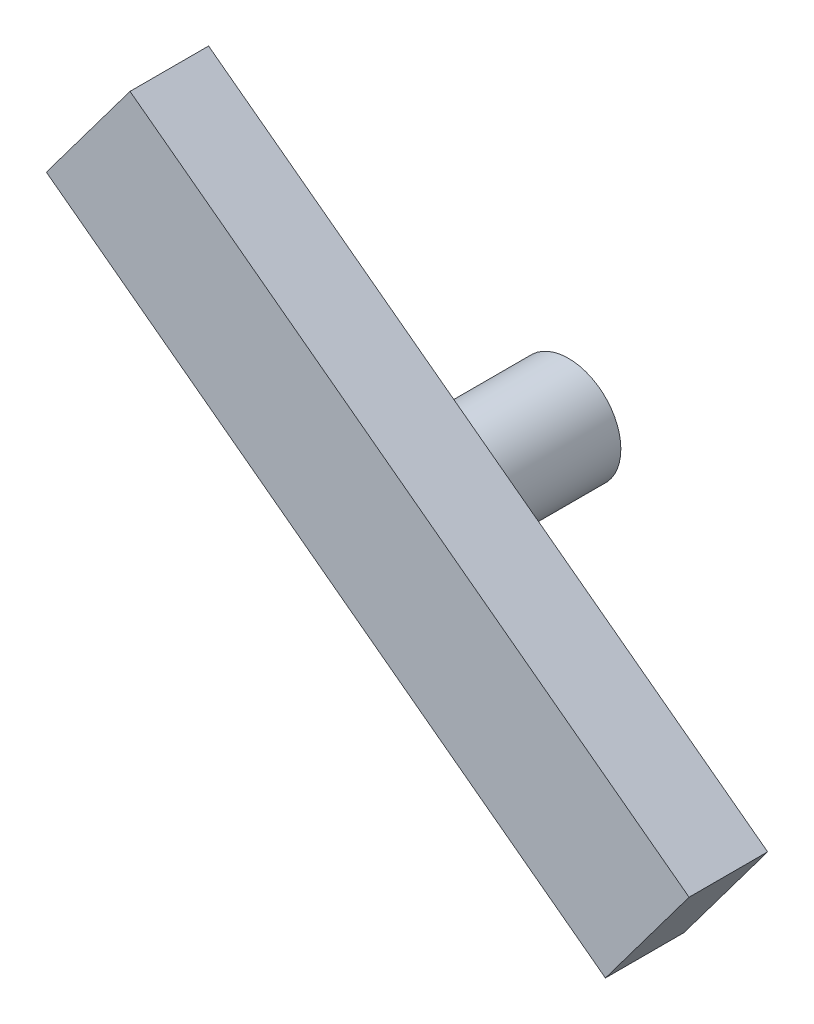
ISO-10303-21;
HEADER;
FILE_DESCRIPTION(('STEP AP214'),'2;1');
FILE_NAME('part.step','',(''),(''),'','','');
FILE_SCHEMA(('AUTOMOTIVE_DESIGN { 1 0 10303 214 1 1 1 1 }'));
ENDSEC;
DATA;
#1=APPLICATION_CONTEXT('core data for automotive mechanical design processes');
#2=APPLICATION_PROTOCOL_DEFINITION('international standard','automotive_design',2000,#1);
#3=PRODUCT_CONTEXT('',#1,'mechanical');
#4=PRODUCT('Part','Part','',(#3));
#5=PRODUCT_RELATED_PRODUCT_CATEGORY('part','',(#4));
#6=PRODUCT_DEFINITION_FORMATION('','',#4);
#7=PRODUCT_DEFINITION_CONTEXT('part definition',#1,'design');
#8=PRODUCT_DEFINITION('design','',#6,#7);
#9=PRODUCT_DEFINITION_SHAPE('','',#8);
#10=(LENGTH_UNIT() NAMED_UNIT(*) SI_UNIT(.MILLI.,.METRE.));
#11=(NAMED_UNIT(*) PLANE_ANGLE_UNIT() SI_UNIT($,.RADIAN.));
#12=(NAMED_UNIT(*) SI_UNIT($,.STERADIAN.) SOLID_ANGLE_UNIT());
#13=UNCERTAINTY_MEASURE_WITH_UNIT(LENGTH_MEASURE(1.E-05),#10,'distance_accuracy_value','');
#14=(GEOMETRIC_REPRESENTATION_CONTEXT(3) GLOBAL_UNCERTAINTY_ASSIGNED_CONTEXT((#13)) GLOBAL_UNIT_ASSIGNED_CONTEXT((#10,
#11,#12)) REPRESENTATION_CONTEXT('',''));
#15=CARTESIAN_POINT('',(0.,0.,0.));
#16=DIRECTION('',(0.,0.,1.));
#17=DIRECTION('',(1.,0.,0.));
#18=AXIS2_PLACEMENT_3D('',#15,#16,#17);
#19=CARTESIAN_POINT('',(-263.128358849387,316.504901667894,-22.));
#20=DIRECTION('',(0.,0.,1.));
#21=DIRECTION('',(1.,0.,0.));
#22=AXIS2_PLACEMENT_3D('',#19,#20,#21);
#23=PLANE('',#22);
#24=CARTESIAN_POINT('',(-263.128358849387,316.504901667894,-22.));
#25=DIRECTION('',(0.,0.,1.));
#26=DIRECTION('',(1.,0.,0.));
#27=AXIS2_PLACEMENT_3D('',#24,#25,#26);
#28=CIRCLE('',#27,3.);
#29=CARTESIAN_POINT('',(-260.128358849387,316.504901667894,-22.));
#30=VERTEX_POINT('',#29);
#31=EDGE_CURVE('E49',#30,#30,#28,.T.);
#32=ORIENTED_EDGE('',*,*,#31,.F.);
#33=EDGE_LOOP('',(#32));
#34=FACE_BOUND('',#33,.T.);
#35=ADVANCED_FACE('F41',(#34),#23,.F.);
#36=CARTESIAN_POINT('',(-263.128358849387,316.504901667894,-22.));
#37=DIRECTION('',(0.,0.,1.));
#38=DIRECTION('',(1.,0.,0.));
#39=AXIS2_PLACEMENT_3D('',#36,#37,#38);
#40=CYLINDRICAL_SURFACE('',#39,3.);
#41=CARTESIAN_POINT('',(-263.128358849387,316.504901667894,-15.));
#42=DIRECTION('',(0.,0.,1.));
#43=DIRECTION('',(1.,0.,0.));
#44=AXIS2_PLACEMENT_3D('',#41,#42,#43);
#45=CIRCLE('',#44,3.);
#46=CARTESIAN_POINT('',(-260.128358849387,316.504901667894,-15.));
#47=VERTEX_POINT('',#46);
#48=EDGE_CURVE('E12',#47,#47,#45,.T.);
#49=ORIENTED_EDGE('',*,*,#48,.F.);
#50=EDGE_LOOP('',(#49));
#51=FACE_BOUND('',#50,.T.);
#52=ORIENTED_EDGE('',*,*,#31,.T.);
#53=EDGE_LOOP('',(#52));
#54=FACE_BOUND('',#53,.T.);
#55=ADVANCED_FACE('F119',(#51,#54),#40,.T.);
#56=CARTESIAN_POINT('',(-281.537950913536,325.28481738683,-10.5));
#57=DIRECTION('',(0.599126640950297,0.800654275017385,0.));
#58=DIRECTION('',(-0.800654275017385,0.599126640950297,0.));
#59=AXIS2_PLACEMENT_3D('',#56,#57,#58);
#60=PLANE('',#59);
#61=DIRECTION('',(0.800654275017385,-0.599126640950297,0.));
#62=VECTOR('',#61,1.);
#63=CARTESIAN_POINT('',(-281.537950913536,325.28481738683,-15.));
#64=LINE('',#63,#62);
#65=CARTESIAN_POINT('',(-281.537950913536,325.28481738683,-15.));
#66=VERTEX_POINT('',#65);
#67=CARTESIAN_POINT('',(-249.51177991284,301.319751748818,-15.));
#68=VERTEX_POINT('',#67);
#69=EDGE_CURVE('E108',#66,#68,#64,.T.);
#70=ORIENTED_EDGE('',*,*,#69,.T.);
#71=DIRECTION('',(0.,0.,-1.));
#72=VECTOR('',#71,1.);
#73=CARTESIAN_POINT('',(-249.51177991284,301.319751748818,-10.5));
#74=LINE('',#73,#72);
#75=CARTESIAN_POINT('',(-249.51177991284,301.319751748818,-10.5));
#76=VERTEX_POINT('',#75);
#77=EDGE_CURVE('E99',#76,#68,#74,.T.);
#78=ORIENTED_EDGE('',*,*,#77,.F.);
#79=DIRECTION('',(0.800654275017385,-0.599126640950297,0.));
#80=VECTOR('',#79,1.);
#81=CARTESIAN_POINT('',(-281.537950913536,325.28481738683,-10.5));
#82=LINE('',#81,#80);
#83=CARTESIAN_POINT('',(-281.537950913536,325.28481738683,-10.5));
#84=VERTEX_POINT('',#83);
#85=EDGE_CURVE('E93',#84,#76,#82,.T.);
#86=ORIENTED_EDGE('',*,*,#85,.F.);
#87=DIRECTION('',(0.,0.,-1.));
#88=VECTOR('',#87,1.);
#89=CARTESIAN_POINT('',(-281.537950913536,325.28481738683,-10.5));
#90=LINE('',#89,#88);
#91=EDGE_CURVE('E104',#84,#66,#90,.T.);
#92=ORIENTED_EDGE('',*,*,#91,.T.);
#93=EDGE_LOOP('',(#70,#78,#86,#92));
#94=FACE_BOUND('',#93,.T.);
#95=ADVANCED_FACE('F122',(#94),#60,.F.);
#96=CARTESIAN_POINT('',(-249.51177991284,301.319751748818,-10.5));
#97=DIRECTION('',(-0.800654275017387,0.599126640950294,0.));
#98=DIRECTION('',(-0.599126640950294,-0.800654275017387,0.));
#99=AXIS2_PLACEMENT_3D('',#96,#97,#98);
#100=PLANE('',#99);
#101=DIRECTION('',(0.599126640950294,0.800654275017387,0.));
#102=VECTOR('',#101,1.);
#103=CARTESIAN_POINT('',(-249.51177991284,301.319751748818,-15.));
#104=LINE('',#103,#102);
#105=CARTESIAN_POINT('',(-244.718766785238,307.724985948958,-15.));
#106=VERTEX_POINT('',#105);
#107=EDGE_CURVE('E98',#68,#106,#104,.T.);
#108=ORIENTED_EDGE('',*,*,#107,.T.);
#109=DIRECTION('',(0.,0.,-1.));
#110=VECTOR('',#109,1.);
#111=CARTESIAN_POINT('',(-244.718766785238,307.724985948958,-10.5));
#112=LINE('',#111,#110);
#113=CARTESIAN_POINT('',(-244.718766785238,307.724985948958,-10.5));
#114=VERTEX_POINT('',#113);
#115=EDGE_CURVE('E96',#114,#106,#112,.T.);
#116=ORIENTED_EDGE('',*,*,#115,.F.);
#117=DIRECTION('',(0.599126640950294,0.800654275017387,0.));
#118=VECTOR('',#117,1.);
#119=CARTESIAN_POINT('',(-249.51177991284,301.319751748818,-10.5));
#120=LINE('',#119,#118);
#121=EDGE_CURVE('E88',#76,#114,#120,.T.);
#122=ORIENTED_EDGE('',*,*,#121,.F.);
#123=ORIENTED_EDGE('',*,*,#77,.T.);
#124=EDGE_LOOP('',(#108,#116,#122,#123));
#125=FACE_BOUND('',#124,.T.);
#126=ADVANCED_FACE('F97',(#125),#100,.F.);
#127=CARTESIAN_POINT('',(-244.718766785238,307.724985948958,-10.5));
#128=DIRECTION('',(-0.599126640950298,-0.800654275017384,0.));
#129=DIRECTION('',(0.800654275017384,-0.599126640950298,0.));
#130=AXIS2_PLACEMENT_3D('',#127,#128,#129);
#131=PLANE('',#130);
#132=DIRECTION('',(-0.800654275017384,0.599126640950298,0.));
#133=VECTOR('',#132,1.);
#134=CARTESIAN_POINT('',(-244.718766785238,307.724985948958,-15.));
#135=LINE('',#134,#133);
#136=CARTESIAN_POINT('',(-276.744937785933,331.690051586969,-15.));
#137=VERTEX_POINT('',#136);
#138=EDGE_CURVE('E74',#106,#137,#135,.T.);
#139=ORIENTED_EDGE('',*,*,#138,.T.);
#140=DIRECTION('',(0.,0.,-1.));
#141=VECTOR('',#140,1.);
#142=CARTESIAN_POINT('',(-276.744937785933,331.690051586969,-10.5));
#143=LINE('',#142,#141);
#144=CARTESIAN_POINT('',(-276.744937785933,331.690051586969,-10.5));
#145=VERTEX_POINT('',#144);
#146=EDGE_CURVE('E100',#145,#137,#143,.T.);
#147=ORIENTED_EDGE('',*,*,#146,.F.);
#148=DIRECTION('',(-0.800654275017384,0.599126640950298,0.));
#149=VECTOR('',#148,1.);
#150=CARTESIAN_POINT('',(-244.718766785238,307.724985948958,-10.5));
#151=LINE('',#150,#149);
#152=EDGE_CURVE('E91',#114,#145,#151,.T.);
#153=ORIENTED_EDGE('',*,*,#152,.F.);
#154=ORIENTED_EDGE('',*,*,#115,.T.);
#155=EDGE_LOOP('',(#139,#147,#153,#154));
#156=FACE_BOUND('',#155,.T.);
#157=ADVANCED_FACE('F102',(#156),#131,.F.);
#158=CARTESIAN_POINT('',(-276.744937785933,331.690051586969,-10.5));
#159=DIRECTION('',(0.800654275017386,-0.599126640950296,0.));
#160=DIRECTION('',(0.599126640950296,0.800654275017386,0.));
#161=AXIS2_PLACEMENT_3D('',#158,#159,#160);
#162=PLANE('',#161);
#163=DIRECTION('',(-0.599126640950296,-0.800654275017386,0.));
#164=VECTOR('',#163,1.);
#165=CARTESIAN_POINT('',(-276.744937785933,331.690051586969,-15.));
#166=LINE('',#165,#164);
#167=EDGE_CURVE('E80',#137,#66,#166,.T.);
#168=ORIENTED_EDGE('',*,*,#167,.T.);
#169=ORIENTED_EDGE('',*,*,#91,.F.);
#170=DIRECTION('',(-0.599126640950296,-0.800654275017386,0.));
#171=VECTOR('',#170,1.);
#172=CARTESIAN_POINT('',(-276.744937785933,331.690051586969,-10.5));
#173=LINE('',#172,#171);
#174=EDGE_CURVE('E57',#145,#84,#173,.T.);
#175=ORIENTED_EDGE('',*,*,#174,.F.);
#176=ORIENTED_EDGE('',*,*,#146,.T.);
#177=EDGE_LOOP('',(#168,#169,#175,#176));
#178=FACE_BOUND('',#177,.T.);
#179=ADVANCED_FACE('F137',(#178),#162,.F.);
#180=CARTESIAN_POINT('',(0.,0.,-10.5));
#181=DIRECTION('',(0.,0.,1.));
#182=DIRECTION('',(1.,0.,0.));
#183=AXIS2_PLACEMENT_3D('',#180,#181,#182);
#184=PLANE('',#183);
#185=ORIENTED_EDGE('',*,*,#85,.T.);
#186=ORIENTED_EDGE('',*,*,#121,.T.);
#187=ORIENTED_EDGE('',*,*,#152,.T.);
#188=ORIENTED_EDGE('',*,*,#174,.T.);
#189=EDGE_LOOP('',(#185,#186,#187,#188));
#190=FACE_BOUND('',#189,.T.);
#191=ADVANCED_FACE('F89',(#190),#184,.T.);
#192=CARTESIAN_POINT('',(0.,0.,-15.));
#193=DIRECTION('',(0.,0.,1.));
#194=DIRECTION('',(1.,0.,0.));
#195=AXIS2_PLACEMENT_3D('',#192,#193,#194);
#196=PLANE('',#195);
#197=ORIENTED_EDGE('',*,*,#48,.T.);
#198=EDGE_LOOP('',(#197));
#199=FACE_BOUND('',#198,.T.);
#200=ORIENTED_EDGE('',*,*,#69,.F.);
#201=ORIENTED_EDGE('',*,*,#167,.F.);
#202=ORIENTED_EDGE('',*,*,#138,.F.);
#203=ORIENTED_EDGE('',*,*,#107,.F.);
#204=EDGE_LOOP('',(#200,#201,#202,#203));
#205=FACE_BOUND('',#204,.T.);
#206=ADVANCED_FACE('F140',(#199,#205),#196,.F.);
#207=CLOSED_SHELL('',(#35,#55,#95,#126,#157,#179,#191,#206));
#208=MANIFOLD_SOLID_BREP('B2',#207);
#209=ADVANCED_BREP_SHAPE_REPRESENTATION('',(#18,#208),#14);
#210=SHAPE_DEFINITION_REPRESENTATION(#9,#209);
ENDSEC;
END-ISO-10303-21;
